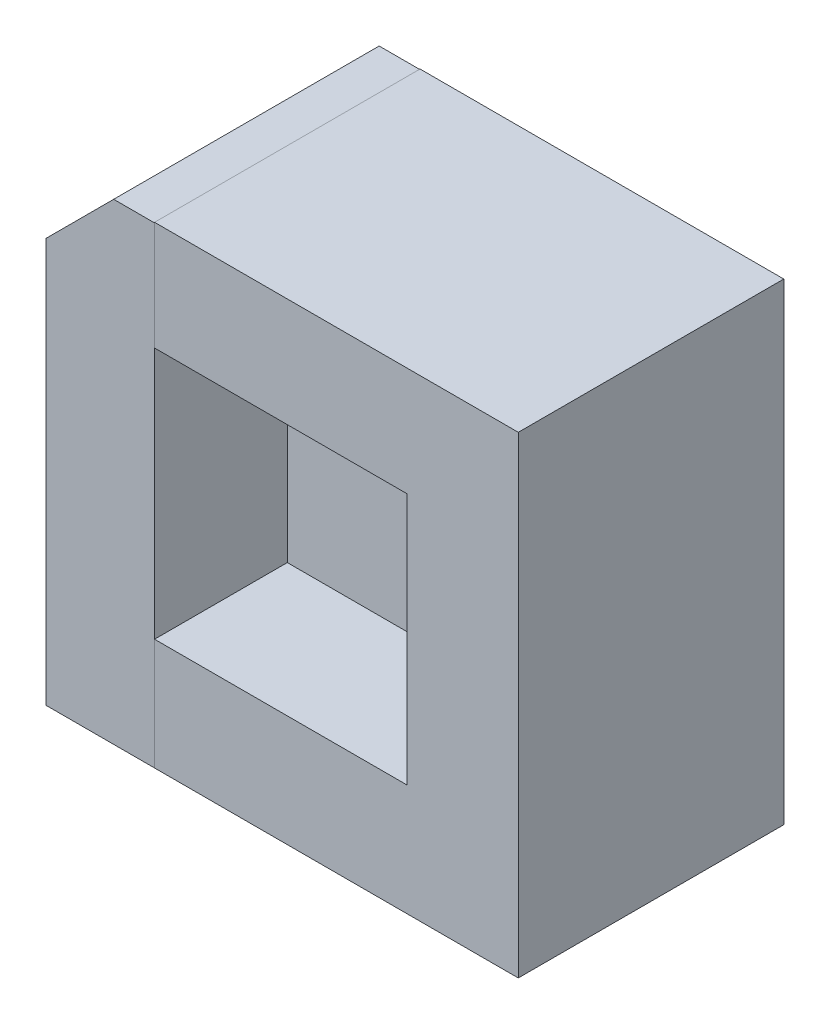
ISO-10303-21;
HEADER;
FILE_DESCRIPTION(('STEP AP214'),'2;1');
FILE_NAME('part.step','',(''),(''),'','','');
FILE_SCHEMA(('AUTOMOTIVE_DESIGN { 1 0 10303 214 1 1 1 1 }'));
ENDSEC;
DATA;
#1=APPLICATION_CONTEXT('core data for automotive mechanical design processes');
#2=APPLICATION_PROTOCOL_DEFINITION('international standard','automotive_design',2000,#1);
#3=PRODUCT_CONTEXT('',#1,'mechanical');
#4=PRODUCT('Part','Part','',(#3));
#5=PRODUCT_RELATED_PRODUCT_CATEGORY('part','',(#4));
#6=PRODUCT_DEFINITION_FORMATION('','',#4);
#7=PRODUCT_DEFINITION_CONTEXT('part definition',#1,'design');
#8=PRODUCT_DEFINITION('design','',#6,#7);
#9=PRODUCT_DEFINITION_SHAPE('','',#8);
#10=(LENGTH_UNIT() NAMED_UNIT(*) SI_UNIT(.MILLI.,.METRE.));
#11=(NAMED_UNIT(*) PLANE_ANGLE_UNIT() SI_UNIT($,.RADIAN.));
#12=(NAMED_UNIT(*) SI_UNIT($,.STERADIAN.) SOLID_ANGLE_UNIT());
#13=UNCERTAINTY_MEASURE_WITH_UNIT(LENGTH_MEASURE(1.E-05),#10,'distance_accuracy_value','');
#14=(GEOMETRIC_REPRESENTATION_CONTEXT(3) GLOBAL_UNCERTAINTY_ASSIGNED_CONTEXT((#13)) GLOBAL_UNIT_ASSIGNED_CONTEXT((#10,
#11,#12)) REPRESENTATION_CONTEXT('',''));
#15=CARTESIAN_POINT('',(0.,0.,0.));
#16=DIRECTION('',(0.,0.,1.));
#17=DIRECTION('',(1.,0.,0.));
#18=AXIS2_PLACEMENT_3D('',#15,#16,#17);
#19=CARTESIAN_POINT('',(-1.00000308,-12.700508,0.));
#20=DIRECTION('',(0.,1.,0.));
#21=DIRECTION('',(1.,0.,0.));
#22=AXIS2_PLACEMENT_3D('',#19,#20,#21);
#23=PLANE('',#22);
#24=DIRECTION('',(1.,0.,0.));
#25=VECTOR('',#24,1.);
#26=CARTESIAN_POINT('',(-1.00000308,-12.700508,0.));
#27=LINE('',#26,#25);
#28=CARTESIAN_POINT('',(-1.00000308,-12.700508,0.));
#29=VERTEX_POINT('',#28);
#30=CARTESIAN_POINT('',(12.69999746,-12.700508,0.));
#31=VERTEX_POINT('',#30);
#32=EDGE_CURVE('P0_E11',#29,#31,#27,.T.);
#33=ORIENTED_EDGE('',*,*,#32,.T.);
#34=DIRECTION('',(0.,0.,1.));
#35=VECTOR('',#34,1.);
#36=CARTESIAN_POINT('',(12.69999746,-12.700508,0.));
#37=LINE('',#36,#35);
#38=CARTESIAN_POINT('',(12.69999746,-12.700508,10.00000032));
#39=VERTEX_POINT('',#38);
#40=EDGE_CURVE('P0_E23',#31,#39,#37,.T.);
#41=ORIENTED_EDGE('',*,*,#40,.T.);
#42=DIRECTION('',(1.,0.,0.));
#43=VECTOR('',#42,1.);
#44=CARTESIAN_POINT('',(-1.00000308,-12.700508,10.00000032));
#45=LINE('',#44,#43);
#46=CARTESIAN_POINT('',(-1.00000308,-12.700508,10.00000032));
#47=VERTEX_POINT('',#46);
#48=EDGE_CURVE('P0_E143',#47,#39,#45,.T.);
#49=ORIENTED_EDGE('',*,*,#48,.F.);
#50=DIRECTION('',(0.,0.,1.));
#51=VECTOR('',#50,1.);
#52=CARTESIAN_POINT('',(-1.00000308,-12.700508,0.));
#53=LINE('',#52,#51);
#54=EDGE_CURVE('P0_E35',#29,#47,#53,.T.);
#55=ORIENTED_EDGE('',*,*,#54,.F.);
#56=EDGE_LOOP('',(#33,#41,#49,#55));
#57=FACE_BOUND('',#56,.T.);
#58=ADVANCED_FACE('P0_F16',(#57),#23,.F.);
#59=CARTESIAN_POINT('',(12.69999746,-12.700508,0.));
#60=DIRECTION('',(-1.,0.,0.));
#61=DIRECTION('',(0.,1.,0.));
#62=AXIS2_PLACEMENT_3D('',#59,#60,#61);
#63=PLANE('',#62);
#64=DIRECTION('',(0.,1.,0.));
#65=VECTOR('',#64,1.);
#66=CARTESIAN_POINT('',(12.69999746,-12.700508,0.));
#67=LINE('',#66,#65);
#68=CARTESIAN_POINT('',(12.69999746,5.09999996,0.));
#69=VERTEX_POINT('',#68);
#70=EDGE_CURVE('P0_E140',#31,#69,#67,.T.);
#71=ORIENTED_EDGE('',*,*,#70,.T.);
#72=DIRECTION('',(0.,0.,1.));
#73=VECTOR('',#72,1.);
#74=CARTESIAN_POINT('',(12.69999746,5.09999996,0.));
#75=LINE('',#74,#73);
#76=CARTESIAN_POINT('',(12.69999746,5.09999996,10.00000032));
#77=VERTEX_POINT('',#76);
#78=EDGE_CURVE('P0_E137',#69,#77,#75,.T.);
#79=ORIENTED_EDGE('',*,*,#78,.T.);
#80=DIRECTION('',(0.,1.,0.));
#81=VECTOR('',#80,1.);
#82=CARTESIAN_POINT('',(12.69999746,-12.700508,10.00000032));
#83=LINE('',#82,#81);
#84=EDGE_CURVE('P0_E135',#39,#77,#83,.T.);
#85=ORIENTED_EDGE('',*,*,#84,.F.);
#86=ORIENTED_EDGE('',*,*,#40,.F.);
#87=EDGE_LOOP('',(#71,#79,#85,#86));
#88=FACE_BOUND('',#87,.T.);
#89=ADVANCED_FACE('P0_F145',(#88),#63,.F.);
#90=CARTESIAN_POINT('',(12.69999746,5.09999996,0.));
#91=DIRECTION('',(0.,-1.,0.));
#92=DIRECTION('',(-1.,0.,0.));
#93=AXIS2_PLACEMENT_3D('',#90,#91,#92);
#94=PLANE('',#93);
#95=DIRECTION('',(-1.,0.,0.));
#96=VECTOR('',#95,1.);
#97=CARTESIAN_POINT('',(12.69999746,5.09999996,0.));
#98=LINE('',#97,#96);
#99=CARTESIAN_POINT('',(-1.00000308,5.09999996,0.));
#100=VERTEX_POINT('',#99);
#101=EDGE_CURVE('P0_E132',#69,#100,#98,.T.);
#102=ORIENTED_EDGE('',*,*,#101,.T.);
#103=DIRECTION('',(0.,0.,1.));
#104=VECTOR('',#103,1.);
#105=CARTESIAN_POINT('',(-1.00000308,5.09999996,0.));
#106=LINE('',#105,#104);
#107=CARTESIAN_POINT('',(-1.00000308,5.09999996,10.00000032));
#108=VERTEX_POINT('',#107);
#109=EDGE_CURVE('P0_E129',#100,#108,#106,.T.);
#110=ORIENTED_EDGE('',*,*,#109,.T.);
#111=DIRECTION('',(-1.,0.,0.));
#112=VECTOR('',#111,1.);
#113=CARTESIAN_POINT('',(12.69999746,5.09999996,10.00000032));
#114=LINE('',#113,#112);
#115=EDGE_CURVE('P0_E127',#77,#108,#114,.T.);
#116=ORIENTED_EDGE('',*,*,#115,.F.);
#117=ORIENTED_EDGE('',*,*,#78,.F.);
#118=EDGE_LOOP('',(#102,#110,#116,#117));
#119=FACE_BOUND('',#118,.T.);
#120=ADVANCED_FACE('P0_F149',(#119),#94,.F.);
#121=CARTESIAN_POINT('',(-1.00000308,5.09999996,0.));
#122=DIRECTION('',(1.,0.,0.));
#123=DIRECTION('',(0.,-1.,0.));
#124=AXIS2_PLACEMENT_3D('',#121,#122,#123);
#125=PLANE('',#124);
#126=DIRECTION('',(0.,-1.,0.));
#127=VECTOR('',#126,1.);
#128=CARTESIAN_POINT('',(-1.00000308,5.09999996,0.));
#129=LINE('',#128,#127);
#130=CARTESIAN_POINT('',(-1.00000308,1.00000054,0.));
#131=VERTEX_POINT('',#130);
#132=EDGE_CURVE('P0_E124',#100,#131,#129,.T.);
#133=ORIENTED_EDGE('',*,*,#132,.T.);
#134=DIRECTION('',(0.,0.,1.));
#135=VECTOR('',#134,1.);
#136=CARTESIAN_POINT('',(-1.00000308,1.00000054,0.));
#137=LINE('',#136,#135);
#138=CARTESIAN_POINT('',(-1.00000308,1.00000054,10.00000032));
#139=VERTEX_POINT('',#138);
#140=EDGE_CURVE('P0_E121',#131,#139,#137,.T.);
#141=ORIENTED_EDGE('',*,*,#140,.T.);
#142=DIRECTION('',(0.,-1.,0.));
#143=VECTOR('',#142,1.);
#144=CARTESIAN_POINT('',(-1.00000308,5.09999996,10.00000032));
#145=LINE('',#144,#143);
#146=EDGE_CURVE('P0_E119',#108,#139,#145,.T.);
#147=ORIENTED_EDGE('',*,*,#146,.F.);
#148=ORIENTED_EDGE('',*,*,#109,.F.);
#149=EDGE_LOOP('',(#133,#141,#147,#148));
#150=FACE_BOUND('',#149,.T.);
#151=ADVANCED_FACE('P0_F153',(#150),#125,.F.);
#152=CARTESIAN_POINT('',(-1.00000308,1.00000054,0.));
#153=DIRECTION('',(0.,1.,0.));
#154=DIRECTION('',(1.,0.,0.));
#155=AXIS2_PLACEMENT_3D('',#152,#153,#154);
#156=PLANE('',#155);
#157=DIRECTION('',(1.,0.,0.));
#158=VECTOR('',#157,1.);
#159=CARTESIAN_POINT('',(-1.00000308,1.00000054,0.));
#160=LINE('',#159,#158);
#161=CARTESIAN_POINT('',(8.49999824,1.00000054,0.));
#162=VERTEX_POINT('',#161);
#163=EDGE_CURVE('P0_E116',#131,#162,#160,.T.);
#164=ORIENTED_EDGE('',*,*,#163,.T.);
#165=DIRECTION('',(0.,0.,1.));
#166=VECTOR('',#165,1.);
#167=CARTESIAN_POINT('',(8.49999824,1.00000054,0.));
#168=LINE('',#167,#166);
#169=CARTESIAN_POINT('',(8.49999824,1.00000054,10.00000032));
#170=VERTEX_POINT('',#169);
#171=EDGE_CURVE('P0_E113',#162,#170,#168,.T.);
#172=ORIENTED_EDGE('',*,*,#171,.T.);
#173=DIRECTION('',(1.,0.,0.));
#174=VECTOR('',#173,1.);
#175=CARTESIAN_POINT('',(-1.00000308,1.00000054,10.00000032));
#176=LINE('',#175,#174);
#177=EDGE_CURVE('P0_E111',#139,#170,#176,.T.);
#178=ORIENTED_EDGE('',*,*,#177,.F.);
#179=ORIENTED_EDGE('',*,*,#140,.F.);
#180=EDGE_LOOP('',(#164,#172,#178,#179));
#181=FACE_BOUND('',#180,.T.);
#182=ADVANCED_FACE('P0_F157',(#181),#156,.F.);
#183=CARTESIAN_POINT('',(8.49999824,1.00000054,0.));
#184=DIRECTION('',(1.,0.,0.));
#185=DIRECTION('',(0.,-1.,0.));
#186=AXIS2_PLACEMENT_3D('',#183,#184,#185);
#187=PLANE('',#186);
#188=DIRECTION('',(0.,-1.,0.));
#189=VECTOR('',#188,1.);
#190=CARTESIAN_POINT('',(8.49999824,1.00000054,0.));
#191=LINE('',#190,#189);
#192=CARTESIAN_POINT('',(8.49999824,-8.50000078,0.));
#193=VERTEX_POINT('',#192);
#194=EDGE_CURVE('P0_E108',#162,#193,#191,.T.);
#195=ORIENTED_EDGE('',*,*,#194,.T.);
#196=DIRECTION('',(0.,0.,1.));
#197=VECTOR('',#196,1.);
#198=CARTESIAN_POINT('',(8.49999824,-8.50000078,0.));
#199=LINE('',#198,#197);
#200=CARTESIAN_POINT('',(8.49999824,-8.50000078,10.00000032));
#201=VERTEX_POINT('',#200);
#202=EDGE_CURVE('P0_E106',#193,#201,#199,.T.);
#203=ORIENTED_EDGE('',*,*,#202,.T.);
#204=DIRECTION('',(0.,-1.,0.));
#205=VECTOR('',#204,1.);
#206=CARTESIAN_POINT('',(8.49999824,1.00000054,10.00000032));
#207=LINE('',#206,#205);
#208=EDGE_CURVE('P0_E86',#170,#201,#207,.T.);
#209=ORIENTED_EDGE('',*,*,#208,.F.);
#210=ORIENTED_EDGE('',*,*,#171,.F.);
#211=EDGE_LOOP('',(#195,#203,#209,#210));
#212=FACE_BOUND('',#211,.T.);
#213=ADVANCED_FACE('P0_F160',(#212),#187,.F.);
#214=CARTESIAN_POINT('',(8.49999824,-8.50000078,0.));
#215=DIRECTION('',(0.,-1.,0.));
#216=DIRECTION('',(-1.,0.,0.));
#217=AXIS2_PLACEMENT_3D('',#214,#215,#216);
#218=PLANE('',#217);
#219=DIRECTION('',(-1.,0.,0.));
#220=VECTOR('',#219,1.);
#221=CARTESIAN_POINT('',(8.49999824,-8.50000078,0.));
#222=LINE('',#221,#220);
#223=CARTESIAN_POINT('',(-1.00000308,-8.50000078,0.));
#224=VERTEX_POINT('',#223);
#225=EDGE_CURVE('P0_E95',#193,#224,#222,.T.);
#226=ORIENTED_EDGE('',*,*,#225,.T.);
#227=DIRECTION('',(0.,0.,1.));
#228=VECTOR('',#227,1.);
#229=CARTESIAN_POINT('',(-1.00000308,-8.50000078,0.));
#230=LINE('',#229,#228);
#231=CARTESIAN_POINT('',(-1.00000308,-8.50000078,10.00000032));
#232=VERTEX_POINT('',#231);
#233=EDGE_CURVE('P0_E89',#224,#232,#230,.T.);
#234=ORIENTED_EDGE('',*,*,#233,.T.);
#235=DIRECTION('',(-1.,0.,0.));
#236=VECTOR('',#235,1.);
#237=CARTESIAN_POINT('',(8.49999824,-8.50000078,10.00000032));
#238=LINE('',#237,#236);
#239=EDGE_CURVE('P0_E80',#201,#232,#238,.T.);
#240=ORIENTED_EDGE('',*,*,#239,.F.);
#241=ORIENTED_EDGE('',*,*,#202,.F.);
#242=EDGE_LOOP('',(#226,#234,#240,#241));
#243=FACE_BOUND('',#242,.T.);
#244=ADVANCED_FACE('P0_F93',(#243),#218,.F.);
#245=CARTESIAN_POINT('',(-1.00000308,-8.50000078,0.));
#246=DIRECTION('',(1.,0.,0.));
#247=DIRECTION('',(0.,-1.,0.));
#248=AXIS2_PLACEMENT_3D('',#245,#246,#247);
#249=PLANE('',#248);
#250=DIRECTION('',(0.,-1.,0.));
#251=VECTOR('',#250,1.);
#252=CARTESIAN_POINT('',(-1.00000308,-8.50000078,0.));
#253=LINE('',#252,#251);
#254=EDGE_CURVE('P0_E90',#224,#29,#253,.T.);
#255=ORIENTED_EDGE('',*,*,#254,.T.);
#256=ORIENTED_EDGE('',*,*,#54,.T.);
#257=DIRECTION('',(0.,-1.,0.));
#258=VECTOR('',#257,1.);
#259=CARTESIAN_POINT('',(-1.00000308,-8.50000078,10.00000032));
#260=LINE('',#259,#258);
#261=EDGE_CURVE('P0_E84',#232,#47,#260,.T.);
#262=ORIENTED_EDGE('',*,*,#261,.F.);
#263=ORIENTED_EDGE('',*,*,#233,.F.);
#264=EDGE_LOOP('',(#255,#256,#262,#263));
#265=FACE_BOUND('',#264,.T.);
#266=ADVANCED_FACE('P0_F100',(#265),#249,.F.);
#267=CARTESIAN_POINT('',(6.464014273776,-3.7886099668301,0.));
#268=DIRECTION('',(0.,0.,1.));
#269=DIRECTION('',(-1.,0.,0.));
#270=AXIS2_PLACEMENT_3D('',#267,#268,#269);
#271=PLANE('',#270);
#272=ORIENTED_EDGE('',*,*,#254,.F.);
#273=ORIENTED_EDGE('',*,*,#225,.F.);
#274=ORIENTED_EDGE('',*,*,#194,.F.);
#275=ORIENTED_EDGE('',*,*,#163,.F.);
#276=ORIENTED_EDGE('',*,*,#132,.F.);
#277=ORIENTED_EDGE('',*,*,#101,.F.);
#278=ORIENTED_EDGE('',*,*,#70,.F.);
#279=ORIENTED_EDGE('',*,*,#32,.F.);
#280=EDGE_LOOP('',(#272,#273,#274,#275,#276,#277,#278,#279));
#281=FACE_BOUND('',#280,.T.);
#282=ADVANCED_FACE('P0_F162',(#281),#271,.F.);
#283=CARTESIAN_POINT('',(6.464014273776,-3.7886099668301,10.00000032));
#284=DIRECTION('',(0.,0.,1.));
#285=DIRECTION('',(-1.,0.,0.));
#286=AXIS2_PLACEMENT_3D('',#283,#284,#285);
#287=PLANE('',#286);
#288=ORIENTED_EDGE('',*,*,#48,.T.);
#289=ORIENTED_EDGE('',*,*,#84,.T.);
#290=ORIENTED_EDGE('',*,*,#115,.T.);
#291=ORIENTED_EDGE('',*,*,#146,.T.);
#292=ORIENTED_EDGE('',*,*,#177,.T.);
#293=ORIENTED_EDGE('',*,*,#208,.T.);
#294=ORIENTED_EDGE('',*,*,#239,.T.);
#295=ORIENTED_EDGE('',*,*,#261,.T.);
#296=EDGE_LOOP('',(#288,#289,#290,#291,#292,#293,#294,#295));
#297=FACE_BOUND('',#296,.T.);
#298=ADVANCED_FACE('P0_F82',(#297),#287,.T.);
#299=CLOSED_SHELL('',(#58,#89,#120,#151,#182,#213,#244,#266,#282,#298));
#300=MANIFOLD_SOLID_BREP('P0_B1',#299);
#301=CARTESIAN_POINT('',(-5.080508,-12.700508,0.));
#302=DIRECTION('',(0.,1.,0.));
#303=DIRECTION('',(1.,0.,0.));
#304=AXIS2_PLACEMENT_3D('',#301,#302,#303);
#305=PLANE('',#304);
#306=DIRECTION('',(1.,0.,0.));
#307=VECTOR('',#306,1.);
#308=CARTESIAN_POINT('',(-5.080508,-12.700508,0.));
#309=LINE('',#308,#307);
#310=CARTESIAN_POINT('',(-5.080508,-12.700508,0.));
#311=VERTEX_POINT('',#310);
#312=CARTESIAN_POINT('',(-1.00000054,-12.700508,0.));
#313=VERTEX_POINT('',#312);
#314=EDGE_CURVE('P1_E11',#311,#313,#309,.T.);
#315=ORIENTED_EDGE('',*,*,#314,.T.);
#316=DIRECTION('',(0.,0.,1.));
#317=VECTOR('',#316,1.);
#318=CARTESIAN_POINT('',(-1.00000054,-12.700508,0.));
#319=LINE('',#318,#317);
#320=CARTESIAN_POINT('',(-1.00000054,-12.700508,10.00000032));
#321=VERTEX_POINT('',#320);
#322=EDGE_CURVE('P1_E23',#313,#321,#319,.T.);
#323=ORIENTED_EDGE('',*,*,#322,.T.);
#324=DIRECTION('',(1.,0.,0.));
#325=VECTOR('',#324,1.);
#326=CARTESIAN_POINT('',(-5.080508,-12.700508,10.00000032));
#327=LINE('',#326,#325);
#328=CARTESIAN_POINT('',(-5.080508,-12.700508,10.00000032));
#329=VERTEX_POINT('',#328);
#330=EDGE_CURVE('P1_E101',#329,#321,#327,.T.);
#331=ORIENTED_EDGE('',*,*,#330,.F.);
#332=DIRECTION('',(0.,0.,1.));
#333=VECTOR('',#332,1.);
#334=CARTESIAN_POINT('',(-5.080508,-12.700508,0.));
#335=LINE('',#334,#333);
#336=EDGE_CURVE('P1_E35',#311,#329,#335,.T.);
#337=ORIENTED_EDGE('',*,*,#336,.F.);
#338=EDGE_LOOP('',(#315,#323,#331,#337));
#339=FACE_BOUND('',#338,.T.);
#340=ADVANCED_FACE('P1_F16',(#339),#305,.F.);
#341=CARTESIAN_POINT('',(-1.00000054,-12.700508,0.));
#342=DIRECTION('',(-1.,0.,0.));
#343=DIRECTION('',(0.,1.,0.));
#344=AXIS2_PLACEMENT_3D('',#341,#342,#343);
#345=PLANE('',#344);
#346=DIRECTION('',(0.,1.,0.));
#347=VECTOR('',#346,1.);
#348=CARTESIAN_POINT('',(-1.00000054,-12.700508,0.));
#349=LINE('',#348,#347);
#350=CARTESIAN_POINT('',(-1.00000054,5.080508,0.));
#351=VERTEX_POINT('',#350);
#352=EDGE_CURVE('P1_E98',#313,#351,#349,.T.);
#353=ORIENTED_EDGE('',*,*,#352,.T.);
#354=DIRECTION('',(0.,0.,1.));
#355=VECTOR('',#354,1.);
#356=CARTESIAN_POINT('',(-1.00000054,5.080508,0.));
#357=LINE('',#356,#355);
#358=CARTESIAN_POINT('',(-1.00000054,5.080508,10.00000032));
#359=VERTEX_POINT('',#358);
#360=EDGE_CURVE('P1_E95',#351,#359,#357,.T.);
#361=ORIENTED_EDGE('',*,*,#360,.T.);
#362=DIRECTION('',(0.,1.,0.));
#363=VECTOR('',#362,1.);
#364=CARTESIAN_POINT('',(-1.00000054,-12.700508,10.00000032));
#365=LINE('',#364,#363);
#366=EDGE_CURVE('P1_E93',#321,#359,#365,.T.);
#367=ORIENTED_EDGE('',*,*,#366,.F.);
#368=ORIENTED_EDGE('',*,*,#322,.F.);
#369=EDGE_LOOP('',(#353,#361,#367,#368));
#370=FACE_BOUND('',#369,.T.);
#371=ADVANCED_FACE('P1_F103',(#370),#345,.F.);
#372=CARTESIAN_POINT('',(-1.00000054,5.080508,0.));
#373=DIRECTION('',(0.,-1.,0.));
#374=DIRECTION('',(-1.,0.,0.));
#375=AXIS2_PLACEMENT_3D('',#372,#373,#374);
#376=PLANE('',#375);
#377=DIRECTION('',(-1.,0.,0.));
#378=VECTOR('',#377,1.);
#379=CARTESIAN_POINT('',(-1.00000054,5.080508,0.));
#380=LINE('',#379,#378);
#381=CARTESIAN_POINT('',(-2.54020828,5.080508,0.));
#382=VERTEX_POINT('',#381);
#383=EDGE_CURVE('P1_E90',#351,#382,#380,.T.);
#384=ORIENTED_EDGE('',*,*,#383,.T.);
#385=DIRECTION('',(0.,0.,1.));
#386=VECTOR('',#385,1.);
#387=CARTESIAN_POINT('',(-2.54020828,5.080508,0.));
#388=LINE('',#387,#386);
#389=CARTESIAN_POINT('',(-2.54020828,5.080508,10.00000032));
#390=VERTEX_POINT('',#389);
#391=EDGE_CURVE('P1_E88',#382,#390,#388,.T.);
#392=ORIENTED_EDGE('',*,*,#391,.T.);
#393=DIRECTION('',(-1.,0.,0.));
#394=VECTOR('',#393,1.);
#395=CARTESIAN_POINT('',(-1.00000054,5.080508,10.00000032));
#396=LINE('',#395,#394);
#397=EDGE_CURVE('P1_E68',#359,#390,#396,.T.);
#398=ORIENTED_EDGE('',*,*,#397,.F.);
#399=ORIENTED_EDGE('',*,*,#360,.F.);
#400=EDGE_LOOP('',(#384,#392,#398,#399));
#401=FACE_BOUND('',#400,.T.);
#402=ADVANCED_FACE('P1_F106',(#401),#376,.F.);
#403=CARTESIAN_POINT('',(-2.54020828,5.080508,0.));
#404=DIRECTION('',(0.707106781186548,-0.707106781186548,0.));
#405=DIRECTION('',(-0.707106781186548,-0.707106781186548,0.));
#406=AXIS2_PLACEMENT_3D('',#403,#404,#405);
#407=PLANE('',#406);
#408=DIRECTION('',(-0.707106781186548,-0.707106781186548,0.));
#409=VECTOR('',#408,1.);
#410=CARTESIAN_POINT('',(-2.54020828,5.080508,0.));
#411=LINE('',#410,#409);
#412=CARTESIAN_POINT('',(-5.08038608,2.5403302,0.));
#413=VERTEX_POINT('',#412);
#414=EDGE_CURVE('P1_E77',#382,#413,#411,.T.);
#415=ORIENTED_EDGE('',*,*,#414,.T.);
#416=DIRECTION('',(0.,0.,1.));
#417=VECTOR('',#416,1.);
#418=CARTESIAN_POINT('',(-5.08038608,2.5403302,0.));
#419=LINE('',#418,#417);
#420=CARTESIAN_POINT('',(-5.08038608,2.5403302,10.00000032));
#421=VERTEX_POINT('',#420);
#422=EDGE_CURVE('P1_E71',#413,#421,#419,.T.);
#423=ORIENTED_EDGE('',*,*,#422,.T.);
#424=DIRECTION('',(-0.707106781186548,-0.707106781186548,0.));
#425=VECTOR('',#424,1.);
#426=CARTESIAN_POINT('',(-2.54020828,5.080508,10.00000032));
#427=LINE('',#426,#425);
#428=EDGE_CURVE('P1_E62',#390,#421,#427,.T.);
#429=ORIENTED_EDGE('',*,*,#428,.F.);
#430=ORIENTED_EDGE('',*,*,#391,.F.);
#431=EDGE_LOOP('',(#415,#423,#429,#430));
#432=FACE_BOUND('',#431,.T.);
#433=ADVANCED_FACE('P1_F75',(#432),#407,.F.);
#434=CARTESIAN_POINT('',(-5.08038608,2.5403302,0.));
#435=DIRECTION('',(0.999999999968004,-7.99956002206949E-06,0.));
#436=DIRECTION('',(-7.99956002206949E-06,-0.999999999968004,0.));
#437=AXIS2_PLACEMENT_3D('',#434,#435,#436);
#438=PLANE('',#437);
#439=DIRECTION('',(-7.99956002206949E-06,-0.999999999968004,0.));
#440=VECTOR('',#439,1.);
#441=CARTESIAN_POINT('',(-5.08038608,2.5403302,0.));
#442=LINE('',#441,#440);
#443=EDGE_CURVE('P1_E72',#413,#311,#442,.T.);
#444=ORIENTED_EDGE('',*,*,#443,.T.);
#445=ORIENTED_EDGE('',*,*,#336,.T.);
#446=DIRECTION('',(-7.99956002206949E-06,-0.999999999968004,0.));
#447=VECTOR('',#446,1.);
#448=CARTESIAN_POINT('',(-5.08038608,2.5403302,10.00000032));
#449=LINE('',#448,#447);
#450=EDGE_CURVE('P1_E66',#421,#329,#449,.T.);
#451=ORIENTED_EDGE('',*,*,#450,.F.);
#452=ORIENTED_EDGE('',*,*,#422,.F.);
#453=EDGE_LOOP('',(#444,#445,#451,#452));
#454=FACE_BOUND('',#453,.T.);
#455=ADVANCED_FACE('P1_F82',(#454),#438,.F.);
#456=CARTESIAN_POINT('',(-2.936701002507,-4.154893065535,0.));
#457=DIRECTION('',(0.,0.,1.));
#458=DIRECTION('',(-1.,0.,0.));
#459=AXIS2_PLACEMENT_3D('',#456,#457,#458);
#460=PLANE('',#459);
#461=ORIENTED_EDGE('',*,*,#443,.F.);
#462=ORIENTED_EDGE('',*,*,#414,.F.);
#463=ORIENTED_EDGE('',*,*,#383,.F.);
#464=ORIENTED_EDGE('',*,*,#352,.F.);
#465=ORIENTED_EDGE('',*,*,#314,.F.);
#466=EDGE_LOOP('',(#461,#462,#463,#464,#465));
#467=FACE_BOUND('',#466,.T.);
#468=ADVANCED_FACE('P1_F108',(#467),#460,.F.);
#469=CARTESIAN_POINT('',(-2.936701002507,-4.154893065535,10.00000032));
#470=DIRECTION('',(0.,0.,1.));
#471=DIRECTION('',(-1.,0.,0.));
#472=AXIS2_PLACEMENT_3D('',#469,#470,#471);
#473=PLANE('',#472);
#474=ORIENTED_EDGE('',*,*,#330,.T.);
#475=ORIENTED_EDGE('',*,*,#366,.T.);
#476=ORIENTED_EDGE('',*,*,#397,.T.);
#477=ORIENTED_EDGE('',*,*,#428,.T.);
#478=ORIENTED_EDGE('',*,*,#450,.T.);
#479=EDGE_LOOP('',(#474,#475,#476,#477,#478));
#480=FACE_BOUND('',#479,.T.);
#481=ADVANCED_FACE('P1_F64',(#480),#473,.T.);
#482=CLOSED_SHELL('',(#340,#371,#402,#433,#455,#468,#481));
#483=MANIFOLD_SOLID_BREP('P1_B1',#482);
#484=CARTESIAN_POINT('',(-1.00000054,1.00000054,0.));
#485=DIRECTION('',(1.,0.,0.));
#486=DIRECTION('',(0.,-1.,0.));
#487=AXIS2_PLACEMENT_3D('',#484,#485,#486);
#488=PLANE('',#487);
#489=DIRECTION('',(0.,-1.,0.));
#490=VECTOR('',#489,1.);
#491=CARTESIAN_POINT('',(-1.00000054,1.00000054,0.));
#492=LINE('',#491,#490);
#493=CARTESIAN_POINT('',(-1.00000054,1.00000054,0.));
#494=VERTEX_POINT('',#493);
#495=CARTESIAN_POINT('',(-1.00000054,-8.50000078,0.));
#496=VERTEX_POINT('',#495);
#497=EDGE_CURVE('P2_E11',#494,#496,#492,.T.);
#498=ORIENTED_EDGE('',*,*,#497,.T.);
#499=DIRECTION('',(0.,0.,1.));
#500=VECTOR('',#499,1.);
#501=CARTESIAN_POINT('',(-1.00000054,-8.50000078,0.));
#502=LINE('',#501,#500);
#503=CARTESIAN_POINT('',(-1.00000054,-8.50000078,5.00000016));
#504=VERTEX_POINT('',#503);
#505=EDGE_CURVE('P2_E23',#496,#504,#502,.T.);
#506=ORIENTED_EDGE('',*,*,#505,.T.);
#507=DIRECTION('',(0.,-1.,0.));
#508=VECTOR('',#507,1.);
#509=CARTESIAN_POINT('',(-1.00000054,1.00000054,5.00000016));
#510=LINE('',#509,#508);
#511=CARTESIAN_POINT('',(-1.00000054,1.00000054,5.00000016));
#512=VERTEX_POINT('',#511);
#513=EDGE_CURVE('P2_E86',#512,#504,#510,.T.);
#514=ORIENTED_EDGE('',*,*,#513,.F.);
#515=DIRECTION('',(0.,0.,1.));
#516=VECTOR('',#515,1.);
#517=CARTESIAN_POINT('',(-1.00000054,1.00000054,0.));
#518=LINE('',#517,#516);
#519=EDGE_CURVE('P2_E35',#494,#512,#518,.T.);
#520=ORIENTED_EDGE('',*,*,#519,.F.);
#521=EDGE_LOOP('',(#498,#506,#514,#520));
#522=FACE_BOUND('',#521,.T.);
#523=ADVANCED_FACE('P2_F16',(#522),#488,.F.);
#524=CARTESIAN_POINT('',(-1.00000054,-8.50000078,0.));
#525=DIRECTION('',(0.,1.,0.));
#526=DIRECTION('',(1.,0.,0.));
#527=AXIS2_PLACEMENT_3D('',#524,#525,#526);
#528=PLANE('',#527);
#529=DIRECTION('',(1.,0.,0.));
#530=VECTOR('',#529,1.);
#531=CARTESIAN_POINT('',(-1.00000054,-8.50000078,0.));
#532=LINE('',#531,#530);
#533=CARTESIAN_POINT('',(8.50000078,-8.50000078,0.));
#534=VERTEX_POINT('',#533);
#535=EDGE_CURVE('P2_E83',#496,#534,#532,.T.);
#536=ORIENTED_EDGE('',*,*,#535,.T.);
#537=DIRECTION('',(0.,0.,1.));
#538=VECTOR('',#537,1.);
#539=CARTESIAN_POINT('',(8.50000078,-8.50000078,0.));
#540=LINE('',#539,#538);
#541=CARTESIAN_POINT('',(8.50000078,-8.50000078,5.00000016));
#542=VERTEX_POINT('',#541);
#543=EDGE_CURVE('P2_E81',#534,#542,#540,.T.);
#544=ORIENTED_EDGE('',*,*,#543,.T.);
#545=DIRECTION('',(1.,0.,0.));
#546=VECTOR('',#545,1.);
#547=CARTESIAN_POINT('',(-1.00000054,-8.50000078,5.00000016));
#548=LINE('',#547,#546);
#549=EDGE_CURVE('P2_E61',#504,#542,#548,.T.);
#550=ORIENTED_EDGE('',*,*,#549,.F.);
#551=ORIENTED_EDGE('',*,*,#505,.F.);
#552=EDGE_LOOP('',(#536,#544,#550,#551));
#553=FACE_BOUND('',#552,.T.);
#554=ADVANCED_FACE('P2_F88',(#553),#528,.F.);
#555=CARTESIAN_POINT('',(8.50000078,-8.50000078,0.));
#556=DIRECTION('',(-1.,0.,0.));
#557=DIRECTION('',(0.,1.,0.));
#558=AXIS2_PLACEMENT_3D('',#555,#556,#557);
#559=PLANE('',#558);
#560=DIRECTION('',(0.,1.,0.));
#561=VECTOR('',#560,1.);
#562=CARTESIAN_POINT('',(8.50000078,-8.50000078,0.));
#563=LINE('',#562,#561);
#564=CARTESIAN_POINT('',(8.50000078,1.00000054,0.));
#565=VERTEX_POINT('',#564);
#566=EDGE_CURVE('P2_E70',#534,#565,#563,.T.);
#567=ORIENTED_EDGE('',*,*,#566,.T.);
#568=DIRECTION('',(0.,0.,1.));
#569=VECTOR('',#568,1.);
#570=CARTESIAN_POINT('',(8.50000078,1.00000054,0.));
#571=LINE('',#570,#569);
#572=CARTESIAN_POINT('',(8.50000078,1.00000054,5.00000016));
#573=VERTEX_POINT('',#572);
#574=EDGE_CURVE('P2_E64',#565,#573,#571,.T.);
#575=ORIENTED_EDGE('',*,*,#574,.T.);
#576=DIRECTION('',(0.,1.,0.));
#577=VECTOR('',#576,1.);
#578=CARTESIAN_POINT('',(8.50000078,-8.50000078,5.00000016));
#579=LINE('',#578,#577);
#580=EDGE_CURVE('P2_E56',#542,#573,#579,.T.);
#581=ORIENTED_EDGE('',*,*,#580,.F.);
#582=ORIENTED_EDGE('',*,*,#543,.F.);
#583=EDGE_LOOP('',(#567,#575,#581,#582));
#584=FACE_BOUND('',#583,.T.);
#585=ADVANCED_FACE('P2_F68',(#584),#559,.F.);
#586=CARTESIAN_POINT('',(8.50000078,1.00000054,0.));
#587=DIRECTION('',(0.,-1.,0.));
#588=DIRECTION('',(-1.,0.,0.));
#589=AXIS2_PLACEMENT_3D('',#586,#587,#588);
#590=PLANE('',#589);
#591=DIRECTION('',(-1.,0.,0.));
#592=VECTOR('',#591,1.);
#593=CARTESIAN_POINT('',(8.50000078,1.00000054,0.));
#594=LINE('',#593,#592);
#595=EDGE_CURVE('P2_E65',#565,#494,#594,.T.);
#596=ORIENTED_EDGE('',*,*,#595,.T.);
#597=ORIENTED_EDGE('',*,*,#519,.T.);
#598=DIRECTION('',(-1.,0.,0.));
#599=VECTOR('',#598,1.);
#600=CARTESIAN_POINT('',(8.50000078,1.00000054,5.00000016));
#601=LINE('',#600,#599);
#602=EDGE_CURVE('P2_E60',#573,#512,#601,.T.);
#603=ORIENTED_EDGE('',*,*,#602,.F.);
#604=ORIENTED_EDGE('',*,*,#574,.F.);
#605=EDGE_LOOP('',(#596,#597,#603,#604));
#606=FACE_BOUND('',#605,.T.);
#607=ADVANCED_FACE('P2_F75',(#606),#590,.F.);
#608=CARTESIAN_POINT('',(3.75000012,-3.75000012,0.));
#609=DIRECTION('',(0.,0.,1.));
#610=DIRECTION('',(-1.,0.,0.));
#611=AXIS2_PLACEMENT_3D('',#608,#609,#610);
#612=PLANE('',#611);
#613=ORIENTED_EDGE('',*,*,#595,.F.);
#614=ORIENTED_EDGE('',*,*,#566,.F.);
#615=ORIENTED_EDGE('',*,*,#535,.F.);
#616=ORIENTED_EDGE('',*,*,#497,.F.);
#617=EDGE_LOOP('',(#613,#614,#615,#616));
#618=FACE_BOUND('',#617,.T.);
#619=ADVANCED_FACE('P2_F90',(#618),#612,.F.);
#620=CARTESIAN_POINT('',(3.75000012,-3.75000012,5.00000016));
#621=DIRECTION('',(0.,0.,1.));
#622=DIRECTION('',(-1.,0.,0.));
#623=AXIS2_PLACEMENT_3D('',#620,#621,#622);
#624=PLANE('',#623);
#625=ORIENTED_EDGE('',*,*,#513,.T.);
#626=ORIENTED_EDGE('',*,*,#549,.T.);
#627=ORIENTED_EDGE('',*,*,#580,.T.);
#628=ORIENTED_EDGE('',*,*,#602,.T.);
#629=EDGE_LOOP('',(#625,#626,#627,#628));
#630=FACE_BOUND('',#629,.T.);
#631=ADVANCED_FACE('P2_F58',(#630),#624,.T.);
#632=CLOSED_SHELL('',(#523,#554,#585,#607,#619,#631));
#633=MANIFOLD_SOLID_BREP('P2_B1',#632);
#634=ADVANCED_BREP_SHAPE_REPRESENTATION('',(#18,#300,#483,#633),#14);
#635=SHAPE_DEFINITION_REPRESENTATION(#9,#634);
ENDSEC;
END-ISO-10303-21;
